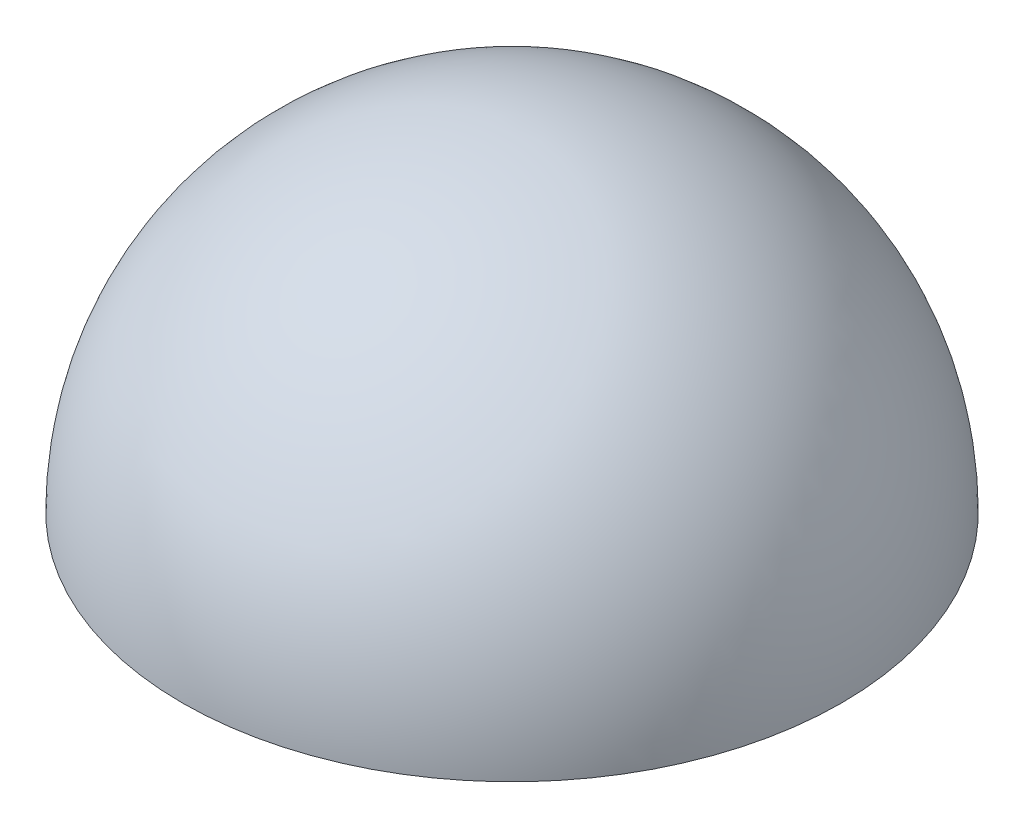
ISO-10303-21;
HEADER;
FILE_DESCRIPTION(('STEP AP214'),'2;1');
FILE_NAME('part.step','',(''),(''),'','','');
FILE_SCHEMA(('AUTOMOTIVE_DESIGN { 1 0 10303 214 1 1 1 1 }'));
ENDSEC;
DATA;
#1=APPLICATION_CONTEXT('core data for automotive mechanical design processes');
#2=APPLICATION_PROTOCOL_DEFINITION('international standard','automotive_design',2000,#1);
#3=PRODUCT_CONTEXT('',#1,'mechanical');
#4=PRODUCT('Part','Part','',(#3));
#5=PRODUCT_RELATED_PRODUCT_CATEGORY('part','',(#4));
#6=PRODUCT_DEFINITION_FORMATION('','',#4);
#7=PRODUCT_DEFINITION_CONTEXT('part definition',#1,'design');
#8=PRODUCT_DEFINITION('design','',#6,#7);
#9=PRODUCT_DEFINITION_SHAPE('','',#8);
#10=(LENGTH_UNIT() NAMED_UNIT(*) SI_UNIT(.MILLI.,.METRE.));
#11=(NAMED_UNIT(*) PLANE_ANGLE_UNIT() SI_UNIT($,.RADIAN.));
#12=(NAMED_UNIT(*) SI_UNIT($,.STERADIAN.) SOLID_ANGLE_UNIT());
#13=UNCERTAINTY_MEASURE_WITH_UNIT(LENGTH_MEASURE(1.E-05),#10,'distance_accuracy_value','');
#14=(GEOMETRIC_REPRESENTATION_CONTEXT(3) GLOBAL_UNCERTAINTY_ASSIGNED_CONTEXT((#13)) GLOBAL_UNIT_ASSIGNED_CONTEXT((#10,
#11,#12)) REPRESENTATION_CONTEXT('',''));
#15=CARTESIAN_POINT('',(0.,0.,0.));
#16=DIRECTION('',(0.,0.,1.));
#17=DIRECTION('',(1.,0.,0.));
#18=AXIS2_PLACEMENT_3D('',#15,#16,#17);
#19=CARTESIAN_POINT('',(0.,0.,0.));
#20=DIRECTION('',(0.,1.,0.));
#21=DIRECTION('',(0.,0.,1.));
#22=AXIS2_PLACEMENT_3D('',#19,#20,#21);
#23=PLANE('',#22);
#24=CARTESIAN_POINT('',(0.,0.,0.));
#25=DIRECTION('',(0.,-1.,0.));
#26=DIRECTION('',(0.,0.,-1.));
#27=AXIS2_PLACEMENT_3D('',#24,#25,#26);
#28=CIRCLE('',#27,12.7);
#29=CARTESIAN_POINT('',(0.,0.,-12.7));
#30=VERTEX_POINT('',#29);
#31=EDGE_CURVE('E10',#30,#30,#28,.T.);
#32=ORIENTED_EDGE('',*,*,#31,.T.);
#33=EDGE_LOOP('',(#32));
#34=FACE_BOUND('',#33,.T.);
#35=ADVANCED_FACE('F31',(#34),#23,.F.);
#36=CARTESIAN_POINT('',(0.,0.,0.));
#37=DIRECTION('',(0.,-1.,0.));
#38=DIRECTION('',(0.,0.,1.));
#39=AXIS2_PLACEMENT_3D('',#36,#37,#38);
#40=SPHERICAL_SURFACE('',#39,12.7);
#41=ORIENTED_EDGE('',*,*,#31,.F.);
#42=EDGE_LOOP('',(#41));
#43=FACE_BOUND('',#42,.T.);
#44=ADVANCED_FACE('F39',(#43),#40,.T.);
#45=CLOSED_SHELL('',(#35,#44));
#46=MANIFOLD_SOLID_BREP('B2',#45);
#47=ADVANCED_BREP_SHAPE_REPRESENTATION('',(#18,#46),#14);
#48=SHAPE_DEFINITION_REPRESENTATION(#9,#47);
ENDSEC;
END-ISO-10303-21;
